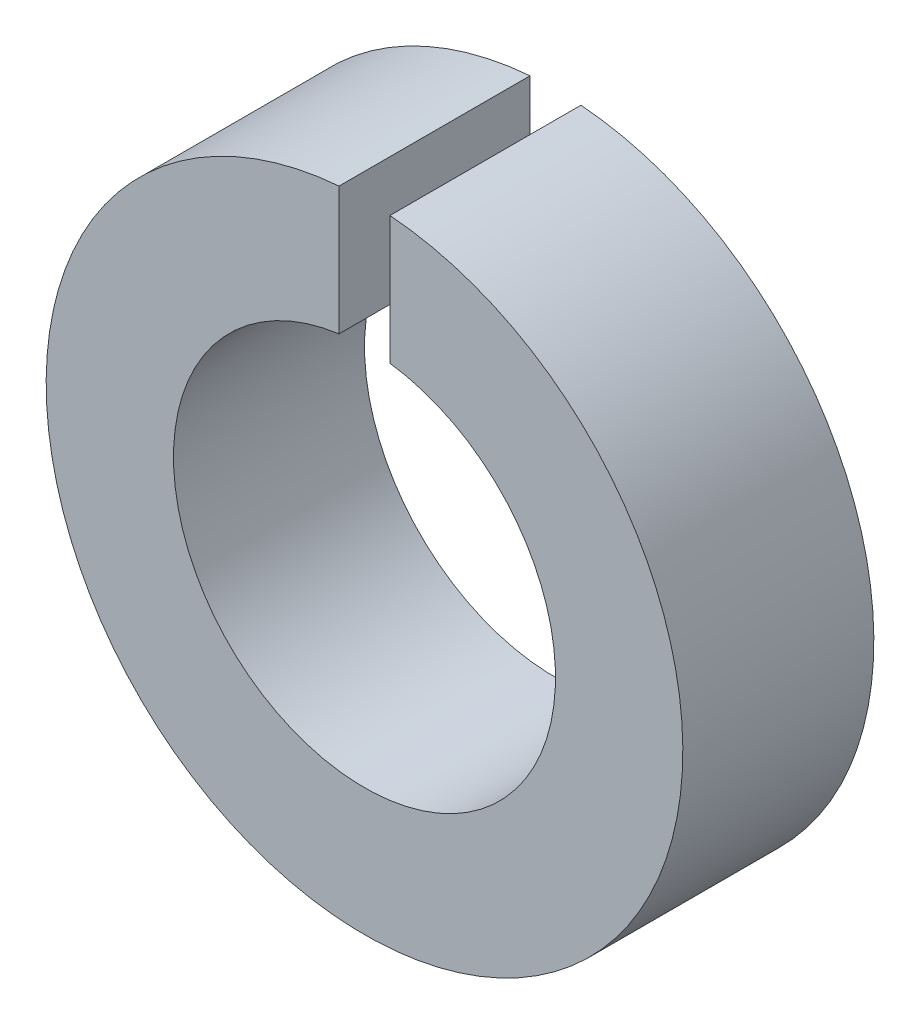
ISO-10303-21;
HEADER;
FILE_DESCRIPTION(('STEP AP214'),'2;1');
FILE_NAME('part.step','',(''),(''),'','','');
FILE_SCHEMA(('AUTOMOTIVE_DESIGN { 1 0 10303 214 1 1 1 1 }'));
ENDSEC;
DATA;
#1=APPLICATION_CONTEXT('core data for automotive mechanical design processes');
#2=APPLICATION_PROTOCOL_DEFINITION('international standard','automotive_design',2000,#1);
#3=PRODUCT_CONTEXT('',#1,'mechanical');
#4=PRODUCT('Part','Part','',(#3));
#5=PRODUCT_RELATED_PRODUCT_CATEGORY('part','',(#4));
#6=PRODUCT_DEFINITION_FORMATION('','',#4);
#7=PRODUCT_DEFINITION_CONTEXT('part definition',#1,'design');
#8=PRODUCT_DEFINITION('design','',#6,#7);
#9=PRODUCT_DEFINITION_SHAPE('','',#8);
#10=(LENGTH_UNIT() NAMED_UNIT(*) SI_UNIT(.MILLI.,.METRE.));
#11=(NAMED_UNIT(*) PLANE_ANGLE_UNIT() SI_UNIT($,.RADIAN.));
#12=(NAMED_UNIT(*) SI_UNIT($,.STERADIAN.) SOLID_ANGLE_UNIT());
#13=UNCERTAINTY_MEASURE_WITH_UNIT(LENGTH_MEASURE(1.E-05),#10,'distance_accuracy_value','');
#14=(GEOMETRIC_REPRESENTATION_CONTEXT(3) GLOBAL_UNCERTAINTY_ASSIGNED_CONTEXT((#13)) GLOBAL_UNIT_ASSIGNED_CONTEXT((#10,
#11,#12)) REPRESENTATION_CONTEXT('',''));
#15=CARTESIAN_POINT('',(0.,0.,0.));
#16=DIRECTION('',(0.,0.,1.));
#17=DIRECTION('',(1.,0.,0.));
#18=AXIS2_PLACEMENT_3D('',#15,#16,#17);
#19=CARTESIAN_POINT('',(0.,0.,4.7625));
#20=DIRECTION('',(0.,0.,-1.));
#21=DIRECTION('',(-1.,0.,0.));
#22=AXIS2_PLACEMENT_3D('',#19,#20,#21);
#23=CYLINDRICAL_SURFACE('',#22,9.525);
#24=CARTESIAN_POINT('',(0.,0.,-4.7625));
#25=DIRECTION('',(0.,0.,-1.));
#26=DIRECTION('',(1.,0.,0.));
#27=AXIS2_PLACEMENT_3D('',#24,#25,#26);
#28=CIRCLE('',#27,9.525);
#29=CARTESIAN_POINT('',(1.27,9.43995365454725,-4.7625));
#30=VERTEX_POINT('',#29);
#31=CARTESIAN_POINT('',(-1.27,9.43995365454725,-4.7625));
#32=VERTEX_POINT('',#31);
#33=EDGE_CURVE('E96',#30,#32,#28,.T.);
#34=ORIENTED_EDGE('',*,*,#33,.T.);
#35=DIRECTION('',(0.,0.,-1.));
#36=VECTOR('',#35,1.);
#37=CARTESIAN_POINT('',(-1.27,9.43995365454725,4.7625));
#38=LINE('',#37,#36);
#39=CARTESIAN_POINT('',(-1.27,9.43995365454725,4.7625));
#40=VERTEX_POINT('',#39);
#41=EDGE_CURVE('E11',#40,#32,#38,.T.);
#42=ORIENTED_EDGE('',*,*,#41,.F.);
#43=CARTESIAN_POINT('',(0.,0.,4.7625));
#44=DIRECTION('',(0.,0.,-1.));
#45=DIRECTION('',(1.,0.,0.));
#46=AXIS2_PLACEMENT_3D('',#43,#44,#45);
#47=CIRCLE('',#46,9.525);
#48=CARTESIAN_POINT('',(1.27,9.43995365454725,4.7625));
#49=VERTEX_POINT('',#48);
#50=EDGE_CURVE('E84',#49,#40,#47,.T.);
#51=ORIENTED_EDGE('',*,*,#50,.F.);
#52=DIRECTION('',(0.,0.,-1.));
#53=VECTOR('',#52,1.);
#54=CARTESIAN_POINT('',(1.27,9.43995365454725,4.7625));
#55=LINE('',#54,#53);
#56=EDGE_CURVE('E92',#49,#30,#55,.T.);
#57=ORIENTED_EDGE('',*,*,#56,.T.);
#58=EDGE_LOOP('',(#34,#42,#51,#57));
#59=FACE_BOUND('',#58,.T.);
#60=ADVANCED_FACE('F33',(#59),#23,.F.);
#61=CARTESIAN_POINT('',(-1.27,9.43995365454725,4.7625));
#62=DIRECTION('',(-1.,0.,0.));
#63=DIRECTION('',(0.,0.,1.));
#64=AXIS2_PLACEMENT_3D('',#61,#62,#63);
#65=PLANE('',#64);
#66=DIRECTION('',(0.,1.,0.));
#67=VECTOR('',#66,1.);
#68=CARTESIAN_POINT('',(-1.27,9.43995365454725,-4.7625));
#69=LINE('',#68,#67);
#70=CARTESIAN_POINT('',(-1.27,15.8241184588589,-4.7625));
#71=VERTEX_POINT('',#70);
#72=EDGE_CURVE('E88',#32,#71,#69,.T.);
#73=ORIENTED_EDGE('',*,*,#72,.T.);
#74=DIRECTION('',(0.,0.,-1.));
#75=VECTOR('',#74,1.);
#76=CARTESIAN_POINT('',(-1.27,15.8241184588589,4.7625));
#77=LINE('',#76,#75);
#78=CARTESIAN_POINT('',(-1.27,15.8241184588589,4.7625));
#79=VERTEX_POINT('',#78);
#80=EDGE_CURVE('E41',#79,#71,#77,.T.);
#81=ORIENTED_EDGE('',*,*,#80,.F.);
#82=DIRECTION('',(0.,1.,0.));
#83=VECTOR('',#82,1.);
#84=CARTESIAN_POINT('',(-1.27,9.43995365454725,4.7625));
#85=LINE('',#84,#83);
#86=EDGE_CURVE('E79',#40,#79,#85,.T.);
#87=ORIENTED_EDGE('',*,*,#86,.F.);
#88=ORIENTED_EDGE('',*,*,#41,.T.);
#89=EDGE_LOOP('',(#73,#81,#87,#88));
#90=FACE_BOUND('',#89,.T.);
#91=ADVANCED_FACE('F87',(#90),#65,.F.);
#92=CARTESIAN_POINT('',(0.,0.,4.7625));
#93=DIRECTION('',(0.,0.,-1.));
#94=DIRECTION('',(-1.,0.,0.));
#95=AXIS2_PLACEMENT_3D('',#92,#93,#94);
#96=CYLINDRICAL_SURFACE('',#95,15.875);
#97=CARTESIAN_POINT('',(0.,0.,-4.7625));
#98=DIRECTION('',(0.,0.,1.));
#99=DIRECTION('',(1.,0.,0.));
#100=AXIS2_PLACEMENT_3D('',#97,#98,#99);
#101=CIRCLE('',#100,15.875);
#102=CARTESIAN_POINT('',(1.27,15.8241184588589,-4.7625));
#103=VERTEX_POINT('',#102);
#104=EDGE_CURVE('E66',#71,#103,#101,.T.);
#105=ORIENTED_EDGE('',*,*,#104,.T.);
#106=DIRECTION('',(0.,0.,-1.));
#107=VECTOR('',#106,1.);
#108=CARTESIAN_POINT('',(1.27,15.8241184588589,4.7625));
#109=LINE('',#108,#107);
#110=CARTESIAN_POINT('',(1.27,15.8241184588589,4.7625));
#111=VERTEX_POINT('',#110);
#112=EDGE_CURVE('E89',#111,#103,#109,.T.);
#113=ORIENTED_EDGE('',*,*,#112,.F.);
#114=CARTESIAN_POINT('',(0.,0.,4.7625));
#115=DIRECTION('',(0.,0.,1.));
#116=DIRECTION('',(1.,0.,0.));
#117=AXIS2_PLACEMENT_3D('',#114,#115,#116);
#118=CIRCLE('',#117,15.875);
#119=EDGE_CURVE('E82',#79,#111,#118,.T.);
#120=ORIENTED_EDGE('',*,*,#119,.F.);
#121=ORIENTED_EDGE('',*,*,#80,.T.);
#122=EDGE_LOOP('',(#105,#113,#120,#121));
#123=FACE_BOUND('',#122,.T.);
#124=ADVANCED_FACE('F90',(#123),#96,.T.);
#125=CARTESIAN_POINT('',(1.27,9.43995365454725,4.7625));
#126=DIRECTION('',(1.,0.,0.));
#127=DIRECTION('',(0.,1.,0.));
#128=AXIS2_PLACEMENT_3D('',#125,#126,#127);
#129=PLANE('',#128);
#130=DIRECTION('',(0.,-1.,0.));
#131=VECTOR('',#130,1.);
#132=CARTESIAN_POINT('',(1.27,9.43995365454725,-4.7625));
#133=LINE('',#132,#131);
#134=EDGE_CURVE('E72',#103,#30,#133,.T.);
#135=ORIENTED_EDGE('',*,*,#134,.T.);
#136=ORIENTED_EDGE('',*,*,#56,.F.);
#137=DIRECTION('',(0.,-1.,0.));
#138=VECTOR('',#137,1.);
#139=CARTESIAN_POINT('',(1.27,9.43995365454725,4.7625));
#140=LINE('',#139,#138);
#141=EDGE_CURVE('E49',#111,#49,#140,.T.);
#142=ORIENTED_EDGE('',*,*,#141,.F.);
#143=ORIENTED_EDGE('',*,*,#112,.T.);
#144=EDGE_LOOP('',(#135,#136,#142,#143));
#145=FACE_BOUND('',#144,.T.);
#146=ADVANCED_FACE('F103',(#145),#129,.F.);
#147=CARTESIAN_POINT('',(0.,0.,4.7625));
#148=DIRECTION('',(0.,0.,1.));
#149=DIRECTION('',(1.,0.,0.));
#150=AXIS2_PLACEMENT_3D('',#147,#148,#149);
#151=PLANE('',#150);
#152=ORIENTED_EDGE('',*,*,#50,.T.);
#153=ORIENTED_EDGE('',*,*,#86,.T.);
#154=ORIENTED_EDGE('',*,*,#119,.T.);
#155=ORIENTED_EDGE('',*,*,#141,.T.);
#156=EDGE_LOOP('',(#152,#153,#154,#155));
#157=FACE_BOUND('',#156,.T.);
#158=ADVANCED_FACE('F80',(#157),#151,.T.);
#159=CARTESIAN_POINT('',(0.,0.,-4.7625));
#160=DIRECTION('',(0.,0.,1.));
#161=DIRECTION('',(1.,0.,0.));
#162=AXIS2_PLACEMENT_3D('',#159,#160,#161);
#163=PLANE('',#162);
#164=ORIENTED_EDGE('',*,*,#33,.F.);
#165=ORIENTED_EDGE('',*,*,#134,.F.);
#166=ORIENTED_EDGE('',*,*,#104,.F.);
#167=ORIENTED_EDGE('',*,*,#72,.F.);
#168=EDGE_LOOP('',(#164,#165,#166,#167));
#169=FACE_BOUND('',#168,.T.);
#170=ADVANCED_FACE('F106',(#169),#163,.F.);
#171=CLOSED_SHELL('',(#60,#91,#124,#146,#158,#170));
#172=MANIFOLD_SOLID_BREP('B2',#171);
#173=ADVANCED_BREP_SHAPE_REPRESENTATION('',(#18,#172),#14);
#174=SHAPE_DEFINITION_REPRESENTATION(#9,#173);
ENDSEC;
END-ISO-10303-21;
